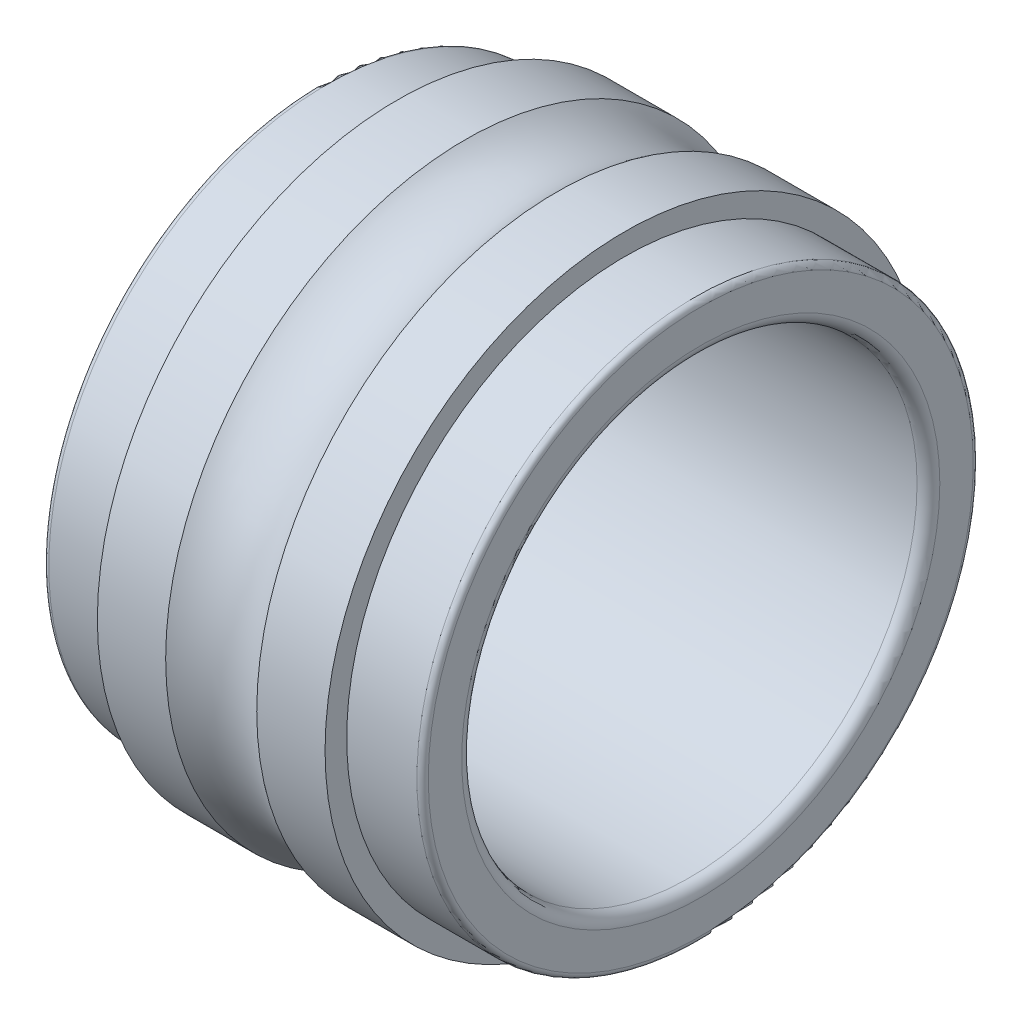
ISO-10303-21;
HEADER;
FILE_DESCRIPTION(('STEP AP214'),'2;1');
FILE_NAME('part.step','',(''),(''),'','','');
FILE_SCHEMA(('AUTOMOTIVE_DESIGN { 1 0 10303 214 1 1 1 1 }'));
ENDSEC;
DATA;
#1=APPLICATION_CONTEXT('core data for automotive mechanical design processes');
#2=APPLICATION_PROTOCOL_DEFINITION('international standard','automotive_design',2000,#1);
#3=PRODUCT_CONTEXT('',#1,'mechanical');
#4=PRODUCT('Part','Part','',(#3));
#5=PRODUCT_RELATED_PRODUCT_CATEGORY('part','',(#4));
#6=PRODUCT_DEFINITION_FORMATION('','',#4);
#7=PRODUCT_DEFINITION_CONTEXT('part definition',#1,'design');
#8=PRODUCT_DEFINITION('design','',#6,#7);
#9=PRODUCT_DEFINITION_SHAPE('','',#8);
#10=(LENGTH_UNIT() NAMED_UNIT(*) SI_UNIT(.MILLI.,.METRE.));
#11=(NAMED_UNIT(*) PLANE_ANGLE_UNIT() SI_UNIT($,.RADIAN.));
#12=(NAMED_UNIT(*) SI_UNIT($,.STERADIAN.) SOLID_ANGLE_UNIT());
#13=UNCERTAINTY_MEASURE_WITH_UNIT(LENGTH_MEASURE(1.E-05),#10,'distance_accuracy_value','');
#14=(GEOMETRIC_REPRESENTATION_CONTEXT(3) GLOBAL_UNCERTAINTY_ASSIGNED_CONTEXT((#13)) GLOBAL_UNIT_ASSIGNED_CONTEXT((#10,
#11,#12)) REPRESENTATION_CONTEXT('',''));
#15=CARTESIAN_POINT('',(0.,0.,0.));
#16=DIRECTION('',(0.,0.,1.));
#17=DIRECTION('',(1.,0.,0.));
#18=AXIS2_PLACEMENT_3D('',#15,#16,#17);
#19=CARTESIAN_POINT('',(0.074999999999985,0.,0.));
#20=DIRECTION('',(1.,0.,0.));
#21=DIRECTION('',(0.,0.,-1.));
#22=AXIS2_PLACEMENT_3D('',#19,#20,#21);
#23=TOROIDAL_SURFACE('',#22,3.59,0.0749999999999848);
#24=CARTESIAN_POINT('',(0.,0.,0.));
#25=DIRECTION('',(1.,0.,0.));
#26=DIRECTION('',(0.,0.,-1.));
#27=AXIS2_PLACEMENT_3D('',#24,#25,#26);
#28=CIRCLE('',#27,3.59);
#29=CARTESIAN_POINT('',(0.,0.,-3.59));
#30=VERTEX_POINT('',#29);
#31=EDGE_CURVE('E62',#30,#30,#28,.T.);
#32=ORIENTED_EDGE('',*,*,#31,.T.);
#33=EDGE_LOOP('',(#32));
#34=FACE_BOUND('',#33,.T.);
#35=CARTESIAN_POINT('',(0.0750000000000002,0.,0.));
#36=DIRECTION('',(1.,0.,0.));
#37=DIRECTION('',(0.,0.,-1.));
#38=AXIS2_PLACEMENT_3D('',#35,#36,#37);
#39=CIRCLE('',#38,3.665);
#40=CARTESIAN_POINT('',(0.0750000000000002,0.,-3.665));
#41=VERTEX_POINT('',#40);
#42=EDGE_CURVE('E59',#41,#41,#39,.T.);
#43=ORIENTED_EDGE('',*,*,#42,.F.);
#44=EDGE_LOOP('',(#43));
#45=FACE_BOUND('',#44,.T.);
#46=ADVANCED_FACE('F15',(#34,#45),#23,.T.);
#47=CARTESIAN_POINT('',(0.,3.59,0.));
#48=DIRECTION('',(-1.,0.,0.));
#49=DIRECTION('',(0.,0.,1.));
#50=AXIS2_PLACEMENT_3D('',#47,#48,#49);
#51=PLANE('',#50);
#52=CARTESIAN_POINT('',(0.,0.,0.));
#53=DIRECTION('',(1.,0.,0.));
#54=DIRECTION('',(0.,0.,-1.));
#55=AXIS2_PLACEMENT_3D('',#52,#53,#54);
#56=CIRCLE('',#55,3.15);
#57=CARTESIAN_POINT('',(0.,0.,-3.15));
#58=VERTEX_POINT('',#57);
#59=EDGE_CURVE('E56',#58,#58,#56,.T.);
#60=ORIENTED_EDGE('',*,*,#59,.T.);
#61=EDGE_LOOP('',(#60));
#62=FACE_BOUND('',#61,.T.);
#63=ORIENTED_EDGE('',*,*,#31,.F.);
#64=EDGE_LOOP('',(#63));
#65=FACE_BOUND('',#64,.T.);
#66=ADVANCED_FACE('F68',(#62,#65),#51,.T.);
#67=CARTESIAN_POINT('',(5.,0.,0.));
#68=DIRECTION('',(1.,0.,0.));
#69=DIRECTION('',(0.,0.,-1.));
#70=AXIS2_PLACEMENT_3D('',#67,#68,#69);
#71=CYLINDRICAL_SURFACE('',#70,3.665);
#72=ORIENTED_EDGE('',*,*,#42,.T.);
#73=EDGE_LOOP('',(#72));
#74=FACE_BOUND('',#73,.T.);
#75=CARTESIAN_POINT('',(1.,0.,0.));
#76=DIRECTION('',(1.,0.,0.));
#77=DIRECTION('',(0.,0.,-1.));
#78=AXIS2_PLACEMENT_3D('',#75,#76,#77);
#79=CIRCLE('',#78,3.665);
#80=CARTESIAN_POINT('',(1.,0.,-3.665));
#81=VERTEX_POINT('',#80);
#82=EDGE_CURVE('E53',#81,#81,#79,.T.);
#83=ORIENTED_EDGE('',*,*,#82,.F.);
#84=EDGE_LOOP('',(#83));
#85=FACE_BOUND('',#84,.T.);
#86=ADVANCED_FACE('F70',(#74,#85),#71,.T.);
#87=CARTESIAN_POINT('',(0.149999999999969,0.,0.));
#88=DIRECTION('',(1.,0.,0.));
#89=DIRECTION('',(0.,0.,-1.));
#90=AXIS2_PLACEMENT_3D('',#87,#88,#89);
#91=TOROIDAL_SURFACE('',#90,3.15,0.149999999999969);
#92=CARTESIAN_POINT('',(0.15,0.,0.));
#93=DIRECTION('',(1.,0.,0.));
#94=DIRECTION('',(0.,0.,-1.));
#95=AXIS2_PLACEMENT_3D('',#92,#93,#94);
#96=CIRCLE('',#95,3.);
#97=CARTESIAN_POINT('',(0.15,0.,-3.));
#98=VERTEX_POINT('',#97);
#99=EDGE_CURVE('E50',#98,#98,#96,.T.);
#100=ORIENTED_EDGE('',*,*,#99,.T.);
#101=EDGE_LOOP('',(#100));
#102=FACE_BOUND('',#101,.T.);
#103=ORIENTED_EDGE('',*,*,#59,.F.);
#104=EDGE_LOOP('',(#103));
#105=FACE_BOUND('',#104,.T.);
#106=ADVANCED_FACE('F78',(#102,#105),#91,.T.);
#107=CARTESIAN_POINT('',(1.,3.95,0.));
#108=DIRECTION('',(-1.,0.,0.));
#109=DIRECTION('',(0.,0.,1.));
#110=AXIS2_PLACEMENT_3D('',#107,#108,#109);
#111=PLANE('',#110);
#112=ORIENTED_EDGE('',*,*,#82,.T.);
#113=EDGE_LOOP('',(#112));
#114=FACE_BOUND('',#113,.T.);
#115=CARTESIAN_POINT('',(1.,0.,0.));
#116=DIRECTION('',(1.,0.,0.));
#117=DIRECTION('',(0.,0.,-1.));
#118=AXIS2_PLACEMENT_3D('',#115,#116,#117);
#119=CIRCLE('',#118,3.95);
#120=CARTESIAN_POINT('',(1.,0.,-3.95));
#121=VERTEX_POINT('',#120);
#122=EDGE_CURVE('E47',#121,#121,#119,.T.);
#123=ORIENTED_EDGE('',*,*,#122,.F.);
#124=EDGE_LOOP('',(#123));
#125=FACE_BOUND('',#124,.T.);
#126=ADVANCED_FACE('F85',(#114,#125),#111,.T.);
#127=CARTESIAN_POINT('',(5.,0.,0.));
#128=DIRECTION('',(1.,0.,0.));
#129=DIRECTION('',(0.,0.,-1.));
#130=AXIS2_PLACEMENT_3D('',#127,#128,#129);
#131=CYLINDRICAL_SURFACE('',#130,3.);
#132=CARTESIAN_POINT('',(4.85,0.,0.));
#133=DIRECTION('',(1.,0.,0.));
#134=DIRECTION('',(0.,0.,-1.));
#135=AXIS2_PLACEMENT_3D('',#132,#133,#134);
#136=CIRCLE('',#135,3.);
#137=CARTESIAN_POINT('',(4.85,0.,-3.));
#138=VERTEX_POINT('',#137);
#139=EDGE_CURVE('E44',#138,#138,#136,.T.);
#140=ORIENTED_EDGE('',*,*,#139,.T.);
#141=EDGE_LOOP('',(#140));
#142=FACE_BOUND('',#141,.T.);
#143=ORIENTED_EDGE('',*,*,#99,.F.);
#144=EDGE_LOOP('',(#143));
#145=FACE_BOUND('',#144,.T.);
#146=ADVANCED_FACE('F89',(#142,#145),#131,.F.);
#147=CARTESIAN_POINT('',(5.,0.,0.));
#148=DIRECTION('',(1.,0.,0.));
#149=DIRECTION('',(0.,0.,-1.));
#150=AXIS2_PLACEMENT_3D('',#147,#148,#149);
#151=CYLINDRICAL_SURFACE('',#150,3.95);
#152=ORIENTED_EDGE('',*,*,#122,.T.);
#153=EDGE_LOOP('',(#152));
#154=FACE_BOUND('',#153,.T.);
#155=CARTESIAN_POINT('',(1.9,0.,0.));
#156=DIRECTION('',(1.,0.,0.));
#157=DIRECTION('',(0.,0.,-1.));
#158=AXIS2_PLACEMENT_3D('',#155,#156,#157);
#159=CIRCLE('',#158,3.95);
#160=CARTESIAN_POINT('',(1.9,0.,-3.95));
#161=VERTEX_POINT('',#160);
#162=EDGE_CURVE('E41',#161,#161,#159,.T.);
#163=ORIENTED_EDGE('',*,*,#162,.F.);
#164=EDGE_LOOP('',(#163));
#165=FACE_BOUND('',#164,.T.);
#166=ADVANCED_FACE('F93',(#154,#165),#151,.T.);
#167=CARTESIAN_POINT('',(4.85000000000006,0.,0.));
#168=DIRECTION('',(1.,0.,0.));
#169=DIRECTION('',(0.,0.,-1.));
#170=AXIS2_PLACEMENT_3D('',#167,#168,#169);
#171=TOROIDAL_SURFACE('',#170,3.14999999999994,0.149999999999938);
#172=CARTESIAN_POINT('',(5.,0.,0.));
#173=DIRECTION('',(1.,0.,0.));
#174=DIRECTION('',(0.,0.,-1.));
#175=AXIS2_PLACEMENT_3D('',#172,#173,#174);
#176=CIRCLE('',#175,3.14999999999994);
#177=CARTESIAN_POINT('',(5.,0.,-3.14999999999994));
#178=VERTEX_POINT('',#177);
#179=EDGE_CURVE('E38',#178,#178,#176,.T.);
#180=ORIENTED_EDGE('',*,*,#179,.T.);
#181=EDGE_LOOP('',(#180));
#182=FACE_BOUND('',#181,.T.);
#183=ORIENTED_EDGE('',*,*,#139,.F.);
#184=EDGE_LOOP('',(#183));
#185=FACE_BOUND('',#184,.T.);
#186=ADVANCED_FACE('F97',(#182,#185),#171,.T.);
#187=CARTESIAN_POINT('',(2.5,0.,0.));
#188=DIRECTION('',(1.,0.,0.));
#189=DIRECTION('',(0.,0.,-1.));
#190=AXIS2_PLACEMENT_3D('',#187,#188,#189);
#191=TOROIDAL_SURFACE('',#190,4.75,1.);
#192=CARTESIAN_POINT('',(3.1,0.,0.));
#193=DIRECTION('',(1.,0.,0.));
#194=DIRECTION('',(0.,0.,-1.));
#195=AXIS2_PLACEMENT_3D('',#192,#193,#194);
#196=CIRCLE('',#195,3.95);
#197=CARTESIAN_POINT('',(3.1,0.,-3.95));
#198=VERTEX_POINT('',#197);
#199=EDGE_CURVE('E35',#198,#198,#196,.T.);
#200=ORIENTED_EDGE('',*,*,#199,.F.);
#201=EDGE_LOOP('',(#200));
#202=FACE_BOUND('',#201,.T.);
#203=ORIENTED_EDGE('',*,*,#162,.T.);
#204=EDGE_LOOP('',(#203));
#205=FACE_BOUND('',#204,.T.);
#206=ADVANCED_FACE('F101',(#202,#205),#191,.F.);
#207=CARTESIAN_POINT('',(5.,3.15,0.));
#208=DIRECTION('',(1.,0.,0.));
#209=DIRECTION('',(0.,0.,-1.));
#210=AXIS2_PLACEMENT_3D('',#207,#208,#209);
#211=PLANE('',#210);
#212=CARTESIAN_POINT('',(5.,0.,0.));
#213=DIRECTION('',(1.,0.,0.));
#214=DIRECTION('',(0.,0.,-1.));
#215=AXIS2_PLACEMENT_3D('',#212,#213,#214);
#216=CIRCLE('',#215,3.59);
#217=CARTESIAN_POINT('',(5.,0.,-3.59));
#218=VERTEX_POINT('',#217);
#219=EDGE_CURVE('E30',#218,#218,#216,.T.);
#220=ORIENTED_EDGE('',*,*,#219,.T.);
#221=EDGE_LOOP('',(#220));
#222=FACE_BOUND('',#221,.T.);
#223=ORIENTED_EDGE('',*,*,#179,.F.);
#224=EDGE_LOOP('',(#223));
#225=FACE_BOUND('',#224,.T.);
#226=ADVANCED_FACE('F105',(#222,#225),#211,.T.);
#227=CARTESIAN_POINT('',(5.,0.,0.));
#228=DIRECTION('',(1.,0.,0.));
#229=DIRECTION('',(0.,0.,-1.));
#230=AXIS2_PLACEMENT_3D('',#227,#228,#229);
#231=CYLINDRICAL_SURFACE('',#230,3.95);
#232=ORIENTED_EDGE('',*,*,#199,.T.);
#233=EDGE_LOOP('',(#232));
#234=FACE_BOUND('',#233,.T.);
#235=CARTESIAN_POINT('',(4.,0.,0.));
#236=DIRECTION('',(1.,0.,0.));
#237=DIRECTION('',(0.,0.,-1.));
#238=AXIS2_PLACEMENT_3D('',#235,#236,#237);
#239=CIRCLE('',#238,3.95);
#240=CARTESIAN_POINT('',(4.,0.,-3.95));
#241=VERTEX_POINT('',#240);
#242=EDGE_CURVE('E26',#241,#241,#239,.T.);
#243=ORIENTED_EDGE('',*,*,#242,.F.);
#244=EDGE_LOOP('',(#243));
#245=FACE_BOUND('',#244,.T.);
#246=ADVANCED_FACE('F109',(#234,#245),#231,.T.);
#247=CARTESIAN_POINT('',(4.925,0.,0.));
#248=DIRECTION('',(1.,0.,0.));
#249=DIRECTION('',(0.,0.,-1.));
#250=AXIS2_PLACEMENT_3D('',#247,#248,#249);
#251=TOROIDAL_SURFACE('',#250,3.59,0.0749999999999701);
#252=CARTESIAN_POINT('',(4.925,0.,0.));
#253=DIRECTION('',(1.,0.,0.));
#254=DIRECTION('',(0.,0.,-1.));
#255=AXIS2_PLACEMENT_3D('',#252,#253,#254);
#256=CIRCLE('',#255,3.665);
#257=CARTESIAN_POINT('',(4.925,0.,-3.665));
#258=VERTEX_POINT('',#257);
#259=EDGE_CURVE('E22',#258,#258,#256,.T.);
#260=ORIENTED_EDGE('',*,*,#259,.T.);
#261=EDGE_LOOP('',(#260));
#262=FACE_BOUND('',#261,.T.);
#263=ORIENTED_EDGE('',*,*,#219,.F.);
#264=EDGE_LOOP('',(#263));
#265=FACE_BOUND('',#264,.T.);
#266=ADVANCED_FACE('F113',(#262,#265),#251,.T.);
#267=CARTESIAN_POINT('',(4.,3.665,0.));
#268=DIRECTION('',(1.,0.,0.));
#269=DIRECTION('',(0.,0.,-1.));
#270=AXIS2_PLACEMENT_3D('',#267,#268,#269);
#271=PLANE('',#270);
#272=ORIENTED_EDGE('',*,*,#242,.T.);
#273=EDGE_LOOP('',(#272));
#274=FACE_BOUND('',#273,.T.);
#275=CARTESIAN_POINT('',(4.,0.,0.));
#276=DIRECTION('',(1.,0.,0.));
#277=DIRECTION('',(0.,0.,-1.));
#278=AXIS2_PLACEMENT_3D('',#275,#276,#277);
#279=CIRCLE('',#278,3.665);
#280=CARTESIAN_POINT('',(4.,0.,-3.665));
#281=VERTEX_POINT('',#280);
#282=EDGE_CURVE('E10',#281,#281,#279,.T.);
#283=ORIENTED_EDGE('',*,*,#282,.F.);
#284=EDGE_LOOP('',(#283));
#285=FACE_BOUND('',#284,.T.);
#286=ADVANCED_FACE('F116',(#274,#285),#271,.T.);
#287=CARTESIAN_POINT('',(5.,0.,0.));
#288=DIRECTION('',(1.,0.,0.));
#289=DIRECTION('',(0.,0.,-1.));
#290=AXIS2_PLACEMENT_3D('',#287,#288,#289);
#291=CYLINDRICAL_SURFACE('',#290,3.665);
#292=ORIENTED_EDGE('',*,*,#282,.T.);
#293=EDGE_LOOP('',(#292));
#294=FACE_BOUND('',#293,.T.);
#295=ORIENTED_EDGE('',*,*,#259,.F.);
#296=EDGE_LOOP('',(#295));
#297=FACE_BOUND('',#296,.T.);
#298=ADVANCED_FACE('F17',(#294,#297),#291,.T.);
#299=CLOSED_SHELL('',(#46,#66,#86,#106,#126,#146,#166,#186,#206,#226,#246,#266,#286,#298));
#300=MANIFOLD_SOLID_BREP('B1',#299);
#301=ADVANCED_BREP_SHAPE_REPRESENTATION('',(#18,#300),#14);
#302=SHAPE_DEFINITION_REPRESENTATION(#9,#301);
ENDSEC;
END-ISO-10303-21;
